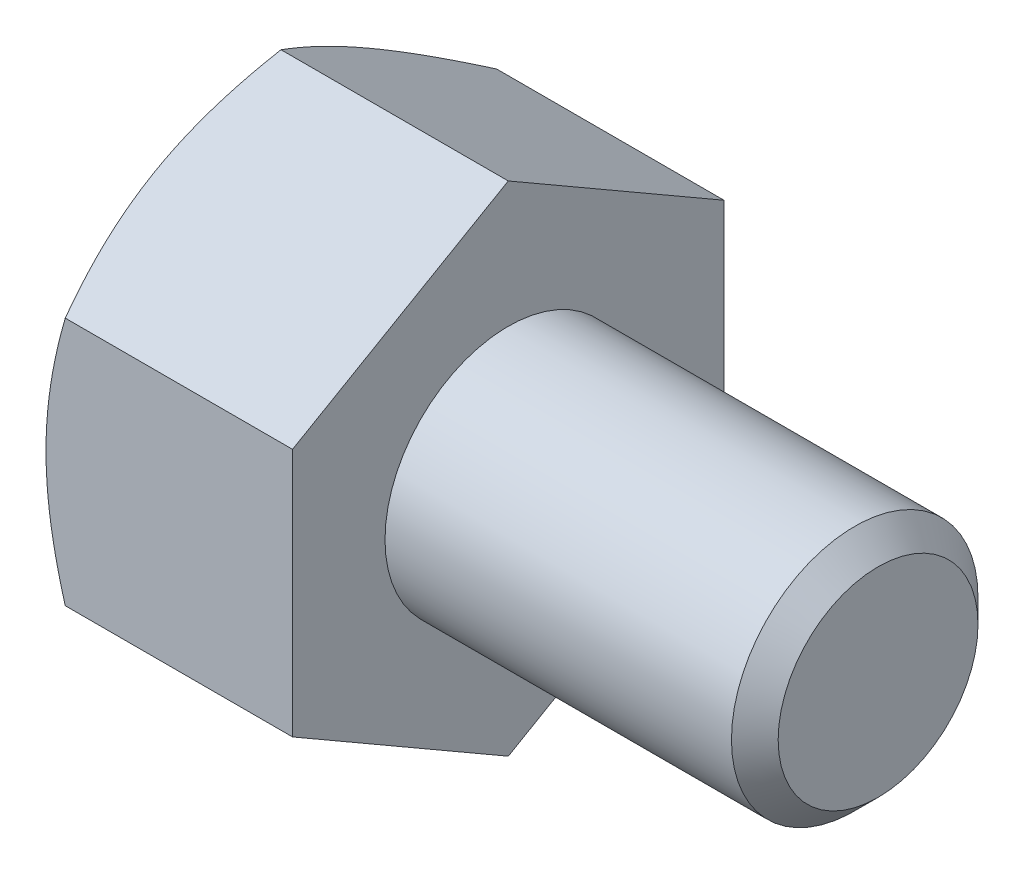
ISO-10303-21;
HEADER;
FILE_DESCRIPTION(('STEP AP214'),'2;1');
FILE_NAME('part.step','',(''),(''),'','','');
FILE_SCHEMA(('AUTOMOTIVE_DESIGN { 1 0 10303 214 1 1 1 1 }'));
ENDSEC;
DATA;
#1=APPLICATION_CONTEXT('core data for automotive mechanical design processes');
#2=APPLICATION_PROTOCOL_DEFINITION('international standard','automotive_design',2000,#1);
#3=PRODUCT_CONTEXT('',#1,'mechanical');
#4=PRODUCT('Part','Part','',(#3));
#5=PRODUCT_RELATED_PRODUCT_CATEGORY('part','',(#4));
#6=PRODUCT_DEFINITION_FORMATION('','',#4);
#7=PRODUCT_DEFINITION_CONTEXT('part definition',#1,'design');
#8=PRODUCT_DEFINITION('design','',#6,#7);
#9=PRODUCT_DEFINITION_SHAPE('','',#8);
#10=(LENGTH_UNIT() NAMED_UNIT(*) SI_UNIT(.MILLI.,.METRE.));
#11=(NAMED_UNIT(*) PLANE_ANGLE_UNIT() SI_UNIT($,.RADIAN.));
#12=(NAMED_UNIT(*) SI_UNIT($,.STERADIAN.) SOLID_ANGLE_UNIT());
#13=UNCERTAINTY_MEASURE_WITH_UNIT(LENGTH_MEASURE(1.E-05),#10,'distance_accuracy_value','');
#14=(GEOMETRIC_REPRESENTATION_CONTEXT(3) GLOBAL_UNCERTAINTY_ASSIGNED_CONTEXT((#13)) GLOBAL_UNIT_ASSIGNED_CONTEXT((#10,
#11,#12)) REPRESENTATION_CONTEXT('',''));
#15=CARTESIAN_POINT('',(0.,0.,0.));
#16=DIRECTION('',(0.,0.,1.));
#17=DIRECTION('',(1.,0.,0.));
#18=AXIS2_PLACEMENT_3D('',#15,#16,#17);
#19=CARTESIAN_POINT('',(-4.,0.,0.));
#20=DIRECTION('',(-1.,0.,0.));
#21=DIRECTION('',(0.,0.,1.));
#22=AXIS2_PLACEMENT_3D('',#19,#20,#21);
#23=PLANE('',#22);
#24=CARTESIAN_POINT('',(-4.,0.,0.));
#25=DIRECTION('',(1.,0.,0.));
#26=DIRECTION('',(0.,1.,0.));
#27=AXIS2_PLACEMENT_3D('',#24,#25,#26);
#28=CIRCLE('',#27,3.5);
#29=CARTESIAN_POINT('',(-4.,-3.03108891324554,-1.75));
#30=VERTEX_POINT('',#29);
#31=CARTESIAN_POINT('',(-4.,0.,-3.5));
#32=VERTEX_POINT('',#31);
#33=EDGE_CURVE('E199',#30,#32,#28,.T.);
#34=ORIENTED_EDGE('',*,*,#33,.F.);
#35=CARTESIAN_POINT('',(-4.,0.,0.));
#36=DIRECTION('',(1.,0.,0.));
#37=DIRECTION('',(0.,1.,0.));
#38=AXIS2_PLACEMENT_3D('',#35,#36,#37);
#39=CIRCLE('',#38,3.5);
#40=CARTESIAN_POINT('',(-4.,-3.03108891324554,1.75));
#41=VERTEX_POINT('',#40);
#42=EDGE_CURVE('E164',#41,#30,#39,.T.);
#43=ORIENTED_EDGE('',*,*,#42,.F.);
#44=CARTESIAN_POINT('',(-4.,0.,0.));
#45=DIRECTION('',(1.,0.,0.));
#46=DIRECTION('',(0.,1.,0.));
#47=AXIS2_PLACEMENT_3D('',#44,#45,#46);
#48=CIRCLE('',#47,3.5);
#49=CARTESIAN_POINT('',(-4.,0.,3.5));
#50=VERTEX_POINT('',#49);
#51=EDGE_CURVE('E188',#50,#41,#48,.T.);
#52=ORIENTED_EDGE('',*,*,#51,.F.);
#53=CARTESIAN_POINT('',(-4.,0.,0.));
#54=DIRECTION('',(1.,0.,0.));
#55=DIRECTION('',(0.,1.,0.));
#56=AXIS2_PLACEMENT_3D('',#53,#54,#55);
#57=CIRCLE('',#56,3.5);
#58=CARTESIAN_POINT('',(-4.,3.03108891324554,1.75));
#59=VERTEX_POINT('',#58);
#60=EDGE_CURVE('E166',#59,#50,#57,.T.);
#61=ORIENTED_EDGE('',*,*,#60,.F.);
#62=CARTESIAN_POINT('',(-4.,0.,0.));
#63=DIRECTION('',(1.,0.,0.));
#64=DIRECTION('',(0.,1.,0.));
#65=AXIS2_PLACEMENT_3D('',#62,#63,#64);
#66=CIRCLE('',#65,3.5);
#67=CARTESIAN_POINT('',(-4.,3.03108891324554,-1.75));
#68=VERTEX_POINT('',#67);
#69=EDGE_CURVE('E210',#68,#59,#66,.T.);
#70=ORIENTED_EDGE('',*,*,#69,.F.);
#71=CARTESIAN_POINT('',(-4.,0.,0.));
#72=DIRECTION('',(1.,0.,0.));
#73=DIRECTION('',(0.,1.,0.));
#74=AXIS2_PLACEMENT_3D('',#71,#72,#73);
#75=CIRCLE('',#74,3.5);
#76=EDGE_CURVE('E56',#32,#68,#75,.T.);
#77=ORIENTED_EDGE('',*,*,#76,.F.);
#78=EDGE_LOOP('',(#34,#43,#52,#61,#70,#77));
#79=FACE_BOUND('',#78,.T.);
#80=ADVANCED_FACE('F39',(#79),#23,.T.);
#81=CARTESIAN_POINT('',(0.,3.03108891324554,-1.75));
#82=DIRECTION('',(0.,0.866025403784439,-0.5));
#83=DIRECTION('',(0.,-0.5,-0.866025403784439));
#84=AXIS2_PLACEMENT_3D('',#81,#82,#83);
#85=PLANE('',#84);
#86=CARTESIAN_POINT('',(-3.68678747896463,4.04249959269281,0.00181468412044147));
#87=CARTESIAN_POINT('',(-4.,3.50042101507722,-0.937092954004437));
#88=CARTESIAN_POINT('',(-4.,3.03108891324554,-1.75));
#89=CARTESIAN_POINT('',(-4.00000000000001,2.56175681141386,-2.56290704599557));
#90=CARTESIAN_POINT('',(-3.68678747896463,2.01967823379826,-3.50181468412044));
#91=(BOUNDED_CURVE() B_SPLINE_CURVE(2,(#86,#87,#88,#89,#90),.UNSPECIFIED.,.F.,
.F.) B_SPLINE_CURVE_WITH_KNOTS((3,2,3),(0.,2.05216073912997,4.10432147825994),
.UNSPECIFIED.) CURVE() GEOMETRIC_REPRESENTATION_ITEM() RATIONAL_B_SPLINE_CURVE((1.,
1.03802697460136,1.,1.03802697460135,1.)) REPRESENTATION_ITEM(''));
#92=CARTESIAN_POINT('',(-3.68739260883024,4.04145188432738,0.));
#93=VERTEX_POINT('',#92);
#94=EDGE_CURVE('E242',#93,#68,#91,.T.);
#95=ORIENTED_EDGE('',*,*,#94,.F.);
#96=DIRECTION('',(-1.,0.,0.));
#97=VECTOR('',#96,1.);
#98=CARTESIAN_POINT('',(0.,4.04145188432738,0.));
#99=LINE('',#98,#97);
#100=CARTESIAN_POINT('',(0.,4.04145188432738,0.));
#101=VERTEX_POINT('',#100);
#102=EDGE_CURVE('E112',#101,#93,#99,.T.);
#103=ORIENTED_EDGE('',*,*,#102,.F.);
#104=DIRECTION('',(0.,0.5,0.866025403784439));
#105=VECTOR('',#104,1.);
#106=CARTESIAN_POINT('',(0.,4.04145188432738,0.));
#107=LINE('',#106,#105);
#108=CARTESIAN_POINT('',(0.,2.02072594216369,-3.5));
#109=VERTEX_POINT('',#108);
#110=EDGE_CURVE('E90',#109,#101,#107,.T.);
#111=ORIENTED_EDGE('',*,*,#110,.F.);
#112=DIRECTION('',(-1.,0.,0.));
#113=VECTOR('',#112,1.);
#114=CARTESIAN_POINT('',(0.,2.02072594216369,-3.5));
#115=LINE('',#114,#113);
#116=CARTESIAN_POINT('',(-3.68739260883024,2.02072594216369,-3.5));
#117=VERTEX_POINT('',#116);
#118=EDGE_CURVE('E82',#109,#117,#115,.T.);
#119=ORIENTED_EDGE('',*,*,#118,.T.);
#120=CARTESIAN_POINT('',(-3.68678747896463,4.04249959269281,0.00181468412044147));
#121=CARTESIAN_POINT('',(-4.,3.50042101507722,-0.937092954004437));
#122=CARTESIAN_POINT('',(-4.,3.03108891324554,-1.75));
#123=CARTESIAN_POINT('',(-4.00000000000001,2.56175681141386,-2.56290704599557));
#124=CARTESIAN_POINT('',(-3.68678747896463,2.01967823379826,-3.50181468412044));
#125=(BOUNDED_CURVE() B_SPLINE_CURVE(2,(#120,#121,#122,#123,#124),.UNSPECIFIED.,.F.,
.F.) B_SPLINE_CURVE_WITH_KNOTS((3,2,3),(0.,2.05216073912997,4.10432147825994),
.UNSPECIFIED.) CURVE() GEOMETRIC_REPRESENTATION_ITEM() RATIONAL_B_SPLINE_CURVE((1.,
1.03802697460136,1.,1.03802697460135,1.)) REPRESENTATION_ITEM(''));
#126=EDGE_CURVE('E200',#68,#117,#125,.T.);
#127=ORIENTED_EDGE('',*,*,#126,.F.);
#128=EDGE_LOOP('',(#95,#103,#111,#119,#127));
#129=FACE_BOUND('',#128,.T.);
#130=ADVANCED_FACE('F320',(#129),#85,.T.);
#131=CARTESIAN_POINT('',(0.,0.,3.5));
#132=DIRECTION('',(0.,0.,1.));
#133=DIRECTION('',(0.,1.,0.));
#134=AXIS2_PLACEMENT_3D('',#131,#132,#133);
#135=PLANE('',#134);
#136=CARTESIAN_POINT('',(-3.68678747896463,-2.02282135889455,3.5));
#137=CARTESIAN_POINT('',(-4.,-0.938664203663368,3.5));
#138=CARTESIAN_POINT('',(-4.,0.,3.5));
#139=CARTESIAN_POINT('',(-4.,0.938664203663368,3.5));
#140=CARTESIAN_POINT('',(-3.68678747896463,2.02282135889455,3.5));
#141=(BOUNDED_CURVE() B_SPLINE_CURVE(2,(#136,#137,#138,#139,#140),.UNSPECIFIED.,.F.,
.F.) B_SPLINE_CURVE_WITH_KNOTS((3,2,3),(0.,2.05216073912997,4.10432147825995),
.UNSPECIFIED.) CURVE() GEOMETRIC_REPRESENTATION_ITEM() RATIONAL_B_SPLINE_CURVE((1.,
1.03802697460136,1.,1.03802697460134,1.)) REPRESENTATION_ITEM(''));
#142=CARTESIAN_POINT('',(-3.68739260883024,-2.02072594216369,3.5));
#143=VERTEX_POINT('',#142);
#144=EDGE_CURVE('E181',#143,#50,#141,.T.);
#145=ORIENTED_EDGE('',*,*,#144,.F.);
#146=DIRECTION('',(-1.,0.,0.));
#147=VECTOR('',#146,1.);
#148=CARTESIAN_POINT('',(0.,-2.02072594216369,3.5));
#149=LINE('',#148,#147);
#150=CARTESIAN_POINT('',(0.,-2.02072594216369,3.5));
#151=VERTEX_POINT('',#150);
#152=EDGE_CURVE('E153',#151,#143,#149,.T.);
#153=ORIENTED_EDGE('',*,*,#152,.F.);
#154=DIRECTION('',(0.,-1.,0.));
#155=VECTOR('',#154,1.);
#156=CARTESIAN_POINT('',(0.,-2.02072594216369,3.5));
#157=LINE('',#156,#155);
#158=CARTESIAN_POINT('',(0.,2.02072594216369,3.5));
#159=VERTEX_POINT('',#158);
#160=EDGE_CURVE('E120',#159,#151,#157,.T.);
#161=ORIENTED_EDGE('',*,*,#160,.F.);
#162=DIRECTION('',(-1.,0.,0.));
#163=VECTOR('',#162,1.);
#164=CARTESIAN_POINT('',(0.,2.02072594216369,3.5));
#165=LINE('',#164,#163);
#166=CARTESIAN_POINT('',(-3.68739260883024,2.02072594216369,3.5));
#167=VERTEX_POINT('',#166);
#168=EDGE_CURVE('E155',#159,#167,#165,.T.);
#169=ORIENTED_EDGE('',*,*,#168,.T.);
#170=CARTESIAN_POINT('',(-3.68678747896463,-2.02282135889455,3.5));
#171=CARTESIAN_POINT('',(-4.,-0.938664203663368,3.5));
#172=CARTESIAN_POINT('',(-4.,0.,3.5));
#173=CARTESIAN_POINT('',(-4.,0.938664203663368,3.5));
#174=CARTESIAN_POINT('',(-3.68678747896463,2.02282135889455,3.5));
#175=(BOUNDED_CURVE() B_SPLINE_CURVE(2,(#170,#171,#172,#173,#174),.UNSPECIFIED.,.F.,
.F.) B_SPLINE_CURVE_WITH_KNOTS((3,2,3),(0.,2.05216073912997,4.10432147825995),
.UNSPECIFIED.) CURVE() GEOMETRIC_REPRESENTATION_ITEM() RATIONAL_B_SPLINE_CURVE((1.,
1.03802697460136,1.,1.03802697460134,1.)) REPRESENTATION_ITEM(''));
#176=EDGE_CURVE('E279',#50,#167,#175,.T.);
#177=ORIENTED_EDGE('',*,*,#176,.F.);
#178=EDGE_LOOP('',(#145,#153,#161,#169,#177));
#179=FACE_BOUND('',#178,.T.);
#180=ADVANCED_FACE('F326',(#179),#135,.T.);
#181=CARTESIAN_POINT('',(0.,3.03108891324554,1.75));
#182=DIRECTION('',(0.,0.866025403784439,0.5));
#183=DIRECTION('',(0.,0.5,-0.866025403784439));
#184=AXIS2_PLACEMENT_3D('',#181,#182,#183);
#185=PLANE('',#184);
#186=CARTESIAN_POINT('',(-3.68678747896463,2.01967823379826,3.50181468412044));
#187=CARTESIAN_POINT('',(-4.,2.56175681141385,2.56290704599557));
#188=CARTESIAN_POINT('',(-4.,3.03108891324554,1.75));
#189=CARTESIAN_POINT('',(-4.,3.50042101507723,0.937092954004432));
#190=CARTESIAN_POINT('',(-3.68678747896463,4.04249959269281,-0.00181468412044195));
#191=(BOUNDED_CURVE() B_SPLINE_CURVE(2,(#186,#187,#188,#189,#190),.UNSPECIFIED.,.F.,
.F.) B_SPLINE_CURVE_WITH_KNOTS((3,2,3),(0.,2.05216073912997,4.10432147825994),
.UNSPECIFIED.) CURVE() GEOMETRIC_REPRESENTATION_ITEM() RATIONAL_B_SPLINE_CURVE((1.,
1.03802697460135,1.,1.03802697460133,1.)) REPRESENTATION_ITEM(''));
#192=EDGE_CURVE('E211',#167,#59,#191,.T.);
#193=ORIENTED_EDGE('',*,*,#192,.F.);
#194=ORIENTED_EDGE('',*,*,#168,.F.);
#195=DIRECTION('',(0.,-0.5,0.866025403784439));
#196=VECTOR('',#195,1.);
#197=CARTESIAN_POINT('',(0.,2.02072594216369,3.5));
#198=LINE('',#197,#196);
#199=EDGE_CURVE('E548',#101,#159,#198,.T.);
#200=ORIENTED_EDGE('',*,*,#199,.F.);
#201=ORIENTED_EDGE('',*,*,#102,.T.);
#202=CARTESIAN_POINT('',(-3.68678747896463,2.01967823379826,3.50181468412044));
#203=CARTESIAN_POINT('',(-4.,2.56175681141385,2.56290704599557));
#204=CARTESIAN_POINT('',(-4.,3.03108891324554,1.75));
#205=CARTESIAN_POINT('',(-4.,3.50042101507723,0.937092954004432));
#206=CARTESIAN_POINT('',(-3.68678747896463,4.04249959269281,-0.00181468412044195));
#207=(BOUNDED_CURVE() B_SPLINE_CURVE(2,(#202,#203,#204,#205,#206),.UNSPECIFIED.,.F.,
.F.) B_SPLINE_CURVE_WITH_KNOTS((3,2,3),(0.,2.05216073912997,4.10432147825994),
.UNSPECIFIED.) CURVE() GEOMETRIC_REPRESENTATION_ITEM() RATIONAL_B_SPLINE_CURVE((1.,
1.03802697460135,1.,1.03802697460133,1.)) REPRESENTATION_ITEM(''));
#208=EDGE_CURVE('E292',#59,#93,#207,.T.);
#209=ORIENTED_EDGE('',*,*,#208,.F.);
#210=EDGE_LOOP('',(#193,#194,#200,#201,#209));
#211=FACE_BOUND('',#210,.T.);
#212=ADVANCED_FACE('F343',(#211),#185,.T.);
#213=CARTESIAN_POINT('',(0.,0.,-3.5));
#214=DIRECTION('',(0.,0.,-1.));
#215=DIRECTION('',(0.,-1.,0.));
#216=AXIS2_PLACEMENT_3D('',#213,#214,#215);
#217=PLANE('',#216);
#218=CARTESIAN_POINT('',(-3.68678747896463,2.02282135889455,-3.5));
#219=CARTESIAN_POINT('',(-4.,0.938664203663368,-3.5));
#220=CARTESIAN_POINT('',(-4.,0.,-3.5));
#221=CARTESIAN_POINT('',(-4.,-0.938664203663368,-3.5));
#222=CARTESIAN_POINT('',(-3.68678747896463,-2.02282135889455,-3.5));
#223=(BOUNDED_CURVE() B_SPLINE_CURVE(2,(#218,#219,#220,#221,#222),.UNSPECIFIED.,.F.,
.F.) B_SPLINE_CURVE_WITH_KNOTS((3,2,3),(0.,2.05216073912997,4.10432147825995),
.UNSPECIFIED.) CURVE() GEOMETRIC_REPRESENTATION_ITEM() RATIONAL_B_SPLINE_CURVE((1.,
1.03802697460134,1.,1.03802697460134,1.)) REPRESENTATION_ITEM(''));
#224=EDGE_CURVE('E209',#117,#32,#223,.T.);
#225=ORIENTED_EDGE('',*,*,#224,.F.);
#226=ORIENTED_EDGE('',*,*,#118,.F.);
#227=DIRECTION('',(0.,1.,0.));
#228=VECTOR('',#227,1.);
#229=CARTESIAN_POINT('',(0.,2.02072594216369,-3.5));
#230=LINE('',#229,#228);
#231=CARTESIAN_POINT('',(0.,-2.02072594216369,-3.5));
#232=VERTEX_POINT('',#231);
#233=EDGE_CURVE('E131',#232,#109,#230,.T.);
#234=ORIENTED_EDGE('',*,*,#233,.F.);
#235=DIRECTION('',(-1.,0.,0.));
#236=VECTOR('',#235,1.);
#237=CARTESIAN_POINT('',(0.,-2.02072594216369,-3.5));
#238=LINE('',#237,#236);
#239=CARTESIAN_POINT('',(-3.68739260883024,-2.02072594216369,-3.5));
#240=VERTEX_POINT('',#239);
#241=EDGE_CURVE('E136',#232,#240,#238,.T.);
#242=ORIENTED_EDGE('',*,*,#241,.T.);
#243=CARTESIAN_POINT('',(-3.68678747896463,2.02282135889455,-3.5));
#244=CARTESIAN_POINT('',(-4.,0.938664203663368,-3.5));
#245=CARTESIAN_POINT('',(-4.,0.,-3.5));
#246=CARTESIAN_POINT('',(-4.,-0.938664203663368,-3.5));
#247=CARTESIAN_POINT('',(-3.68678747896463,-2.02282135889455,-3.5));
#248=(BOUNDED_CURVE() B_SPLINE_CURVE(2,(#243,#244,#245,#246,#247),.UNSPECIFIED.,.F.,
.F.) B_SPLINE_CURVE_WITH_KNOTS((3,2,3),(0.,2.05216073912997,4.10432147825995),
.UNSPECIFIED.) CURVE() GEOMETRIC_REPRESENTATION_ITEM() RATIONAL_B_SPLINE_CURVE((1.,
1.03802697460134,1.,1.03802697460134,1.)) REPRESENTATION_ITEM(''));
#249=EDGE_CURVE('E165',#32,#240,#248,.T.);
#250=ORIENTED_EDGE('',*,*,#249,.F.);
#251=EDGE_LOOP('',(#225,#226,#234,#242,#250));
#252=FACE_BOUND('',#251,.T.);
#253=ADVANCED_FACE('F145',(#252),#217,.T.);
#254=CARTESIAN_POINT('',(0.,-3.03108891324554,-1.75));
#255=DIRECTION('',(0.,-0.866025403784439,-0.5));
#256=DIRECTION('',(0.,-0.5,0.866025403784439));
#257=AXIS2_PLACEMENT_3D('',#254,#255,#256);
#258=PLANE('',#257);
#259=CARTESIAN_POINT('',(-3.68678747896463,-2.01967823379826,-3.50181468412044));
#260=CARTESIAN_POINT('',(-4.,-2.56175681141386,-2.56290704599556));
#261=CARTESIAN_POINT('',(-4.,-3.03108891324554,-1.75));
#262=CARTESIAN_POINT('',(-4.,-3.50042101507721,-0.937092954004439));
#263=CARTESIAN_POINT('',(-3.68678747896463,-4.04249959269281,0.00181468412044005));
#264=(BOUNDED_CURVE() B_SPLINE_CURVE(2,(#259,#260,#261,#262,#263),.UNSPECIFIED.,.F.,
.F.) B_SPLINE_CURVE_WITH_KNOTS((3,2,3),(0.,2.05216073912997,4.10432147825994),
.UNSPECIFIED.) CURVE() GEOMETRIC_REPRESENTATION_ITEM() RATIONAL_B_SPLINE_CURVE((1.,
1.03802697460134,1.,1.03802697460133,1.)) REPRESENTATION_ITEM(''));
#265=EDGE_CURVE('E139',#240,#30,#264,.T.);
#266=ORIENTED_EDGE('',*,*,#265,.F.);
#267=ORIENTED_EDGE('',*,*,#241,.F.);
#268=DIRECTION('',(0.,0.5,-0.866025403784438));
#269=VECTOR('',#268,1.);
#270=CARTESIAN_POINT('',(0.,-2.02072594216369,-3.5));
#271=LINE('',#270,#269);
#272=CARTESIAN_POINT('',(0.,-4.04145188432738,0.));
#273=VERTEX_POINT('',#272);
#274=EDGE_CURVE('E127',#273,#232,#271,.T.);
#275=ORIENTED_EDGE('',*,*,#274,.F.);
#276=DIRECTION('',(-1.,0.,0.));
#277=VECTOR('',#276,1.);
#278=CARTESIAN_POINT('',(0.,-4.04145188432738,0.));
#279=LINE('',#278,#277);
#280=CARTESIAN_POINT('',(-3.68739260883024,-4.04145188432738,0.));
#281=VERTEX_POINT('',#280);
#282=EDGE_CURVE('E143',#273,#281,#279,.T.);
#283=ORIENTED_EDGE('',*,*,#282,.T.);
#284=CARTESIAN_POINT('',(-3.68678747896463,-2.01967823379826,-3.50181468412044));
#285=CARTESIAN_POINT('',(-4.,-2.56175681141386,-2.56290704599556));
#286=CARTESIAN_POINT('',(-4.,-3.03108891324554,-1.75));
#287=CARTESIAN_POINT('',(-4.,-3.50042101507721,-0.937092954004439));
#288=CARTESIAN_POINT('',(-3.68678747896463,-4.04249959269281,0.00181468412044005));
#289=(BOUNDED_CURVE() B_SPLINE_CURVE(2,(#284,#285,#286,#287,#288),.UNSPECIFIED.,.F.,
.F.) B_SPLINE_CURVE_WITH_KNOTS((3,2,3),(0.,2.05216073912997,4.10432147825994),
.UNSPECIFIED.) CURVE() GEOMETRIC_REPRESENTATION_ITEM() RATIONAL_B_SPLINE_CURVE((1.,
1.03802697460134,1.,1.03802697460133,1.)) REPRESENTATION_ITEM(''));
#290=EDGE_CURVE('E75',#30,#281,#289,.T.);
#291=ORIENTED_EDGE('',*,*,#290,.F.);
#292=EDGE_LOOP('',(#266,#267,#275,#283,#291));
#293=FACE_BOUND('',#292,.T.);
#294=ADVANCED_FACE('F137',(#293),#258,.T.);
#295=CARTESIAN_POINT('',(0.,-3.03108891324554,1.75));
#296=DIRECTION('',(0.,-0.866025403784439,0.5));
#297=DIRECTION('',(0.,0.5,0.866025403784439));
#298=AXIS2_PLACEMENT_3D('',#295,#296,#297);
#299=PLANE('',#298);
#300=CARTESIAN_POINT('',(-3.68678747896463,-4.04249959269281,-0.00181468412044504));
#301=CARTESIAN_POINT('',(-4.00000000000001,-3.50042101507722,0.937092954004434));
#302=CARTESIAN_POINT('',(-4.,-3.03108891324554,1.75));
#303=CARTESIAN_POINT('',(-4.,-2.56175681141385,2.56290704599557));
#304=CARTESIAN_POINT('',(-3.68678747896463,-2.01967823379826,3.50181468412045));
#305=(BOUNDED_CURVE() B_SPLINE_CURVE(2,(#300,#301,#302,#303,#304),.UNSPECIFIED.,.F.,
.F.) B_SPLINE_CURVE_WITH_KNOTS((3,2,3),(0.,2.05216073912997,4.10432147825995),
.UNSPECIFIED.) CURVE() GEOMETRIC_REPRESENTATION_ITEM() RATIONAL_B_SPLINE_CURVE((1.,
1.03802697460133,1.,1.03802697460133,1.)) REPRESENTATION_ITEM(''));
#306=EDGE_CURVE('E157',#281,#41,#305,.T.);
#307=ORIENTED_EDGE('',*,*,#306,.F.);
#308=ORIENTED_EDGE('',*,*,#282,.F.);
#309=DIRECTION('',(0.,-0.5,-0.866025403784439));
#310=VECTOR('',#309,1.);
#311=CARTESIAN_POINT('',(0.,-4.04145188432738,0.));
#312=LINE('',#311,#310);
#313=EDGE_CURVE('E133',#151,#273,#312,.T.);
#314=ORIENTED_EDGE('',*,*,#313,.F.);
#315=ORIENTED_EDGE('',*,*,#152,.T.);
#316=CARTESIAN_POINT('',(-3.68678747896463,-4.04249959269281,-0.00181468412044504));
#317=CARTESIAN_POINT('',(-4.00000000000001,-3.50042101507722,0.937092954004434));
#318=CARTESIAN_POINT('',(-4.,-3.03108891324554,1.75));
#319=CARTESIAN_POINT('',(-4.,-2.56175681141385,2.56290704599557));
#320=CARTESIAN_POINT('',(-3.68678747896463,-2.01967823379826,3.50181468412045));
#321=(BOUNDED_CURVE() B_SPLINE_CURVE(2,(#316,#317,#318,#319,#320),.UNSPECIFIED.,.F.,
.F.) B_SPLINE_CURVE_WITH_KNOTS((3,2,3),(0.,2.05216073912997,4.10432147825995),
.UNSPECIFIED.) CURVE() GEOMETRIC_REPRESENTATION_ITEM() RATIONAL_B_SPLINE_CURVE((1.,
1.03802697460133,1.,1.03802697460133,1.)) REPRESENTATION_ITEM(''));
#322=EDGE_CURVE('E241',#41,#143,#321,.T.);
#323=ORIENTED_EDGE('',*,*,#322,.F.);
#324=EDGE_LOOP('',(#307,#308,#314,#315,#323));
#325=FACE_BOUND('',#324,.T.);
#326=ADVANCED_FACE('F340',(#325),#299,.T.);
#327=CARTESIAN_POINT('',(-3.84339373948232,0.,0.));
#328=DIRECTION('',(1.,0.,0.));
#329=DIRECTION('',(0.,1.,0.));
#330=AXIS2_PLACEMENT_3D('',#327,#328,#329);
#331=CONICAL_SURFACE('',#330,3.77125,1.0471975511966);
#332=ORIENTED_EDGE('',*,*,#126,.T.);
#333=ORIENTED_EDGE('',*,*,#224,.T.);
#334=ORIENTED_EDGE('',*,*,#76,.T.);
#335=EDGE_LOOP('',(#332,#333,#334));
#336=FACE_BOUND('',#335,.T.);
#337=ADVANCED_FACE('F346',(#336),#331,.T.);
#338=CARTESIAN_POINT('',(-3.84339373948232,0.,0.));
#339=DIRECTION('',(1.,0.,0.));
#340=DIRECTION('',(0.,1.,0.));
#341=AXIS2_PLACEMENT_3D('',#338,#339,#340);
#342=CONICAL_SURFACE('',#341,3.77125,1.0471975511966);
#343=ORIENTED_EDGE('',*,*,#208,.T.);
#344=ORIENTED_EDGE('',*,*,#94,.T.);
#345=ORIENTED_EDGE('',*,*,#69,.T.);
#346=EDGE_LOOP('',(#343,#344,#345));
#347=FACE_BOUND('',#346,.T.);
#348=ADVANCED_FACE('F348',(#347),#342,.T.);
#349=CARTESIAN_POINT('',(-3.84339373948232,0.,0.));
#350=DIRECTION('',(1.,0.,0.));
#351=DIRECTION('',(0.,1.,0.));
#352=AXIS2_PLACEMENT_3D('',#349,#350,#351);
#353=CONICAL_SURFACE('',#352,3.77125,1.0471975511966);
#354=ORIENTED_EDGE('',*,*,#176,.T.);
#355=ORIENTED_EDGE('',*,*,#192,.T.);
#356=ORIENTED_EDGE('',*,*,#60,.T.);
#357=EDGE_LOOP('',(#354,#355,#356));
#358=FACE_BOUND('',#357,.T.);
#359=ADVANCED_FACE('F336',(#358),#353,.T.);
#360=CARTESIAN_POINT('',(-3.84339373948232,0.,0.));
#361=DIRECTION('',(1.,0.,0.));
#362=DIRECTION('',(0.,1.,0.));
#363=AXIS2_PLACEMENT_3D('',#360,#361,#362);
#364=CONICAL_SURFACE('',#363,3.77125,1.0471975511966);
#365=ORIENTED_EDGE('',*,*,#144,.T.);
#366=ORIENTED_EDGE('',*,*,#51,.T.);
#367=ORIENTED_EDGE('',*,*,#322,.T.);
#368=EDGE_LOOP('',(#365,#366,#367));
#369=FACE_BOUND('',#368,.T.);
#370=ADVANCED_FACE('F332',(#369),#364,.T.);
#371=CARTESIAN_POINT('',(-3.84339373948232,0.,0.));
#372=DIRECTION('',(1.,0.,0.));
#373=DIRECTION('',(0.,1.,0.));
#374=AXIS2_PLACEMENT_3D('',#371,#372,#373);
#375=CONICAL_SURFACE('',#374,3.77125,1.0471975511966);
#376=ORIENTED_EDGE('',*,*,#306,.T.);
#377=ORIENTED_EDGE('',*,*,#42,.T.);
#378=ORIENTED_EDGE('',*,*,#290,.T.);
#379=EDGE_LOOP('',(#376,#377,#378));
#380=FACE_BOUND('',#379,.T.);
#381=ADVANCED_FACE('F335',(#380),#375,.T.);
#382=CARTESIAN_POINT('',(-3.84339373948232,0.,0.));
#383=DIRECTION('',(1.,0.,0.));
#384=DIRECTION('',(0.,1.,0.));
#385=AXIS2_PLACEMENT_3D('',#382,#383,#384);
#386=CONICAL_SURFACE('',#385,3.77125,1.0471975511966);
#387=ORIENTED_EDGE('',*,*,#265,.T.);
#388=ORIENTED_EDGE('',*,*,#33,.T.);
#389=ORIENTED_EDGE('',*,*,#249,.T.);
#390=EDGE_LOOP('',(#387,#388,#389));
#391=FACE_BOUND('',#390,.T.);
#392=ADVANCED_FACE('F357',(#391),#386,.T.);
#393=CARTESIAN_POINT('',(0.,0.,0.));
#394=DIRECTION('',(-1.,0.,0.));
#395=DIRECTION('',(0.,-1.,0.));
#396=AXIS2_PLACEMENT_3D('',#393,#394,#395);
#397=PLANE('',#396);
#398=CARTESIAN_POINT('',(0.,0.,0.));
#399=DIRECTION('',(-1.,0.,0.));
#400=DIRECTION('',(0.,0.,1.));
#401=AXIS2_PLACEMENT_3D('',#398,#399,#400);
#402=CIRCLE('',#401,2.);
#403=CARTESIAN_POINT('',(0.,0.,2.));
#404=VERTEX_POINT('',#403);
#405=EDGE_CURVE('E547',#404,#404,#402,.T.);
#406=ORIENTED_EDGE('',*,*,#405,.T.);
#407=EDGE_LOOP('',(#406));
#408=FACE_BOUND('',#407,.T.);
#409=ORIENTED_EDGE('',*,*,#199,.T.);
#410=ORIENTED_EDGE('',*,*,#160,.T.);
#411=ORIENTED_EDGE('',*,*,#313,.T.);
#412=ORIENTED_EDGE('',*,*,#274,.T.);
#413=ORIENTED_EDGE('',*,*,#233,.T.);
#414=ORIENTED_EDGE('',*,*,#110,.T.);
#415=EDGE_LOOP('',(#409,#410,#411,#412,#413,#414));
#416=FACE_BOUND('',#415,.T.);
#417=ADVANCED_FACE('F129',(#408,#416),#397,.F.);
#418=CARTESIAN_POINT('',(6.,0.,0.));
#419=DIRECTION('',(-1.,0.,0.));
#420=DIRECTION('',(0.,0.,1.));
#421=AXIS2_PLACEMENT_3D('',#418,#419,#420);
#422=CYLINDRICAL_SURFACE('',#421,2.);
#423=CARTESIAN_POINT('',(5.62112500000001,0.,0.));
#424=DIRECTION('',(1.,0.,0.));
#425=DIRECTION('',(0.,0.,-1.));
#426=AXIS2_PLACEMENT_3D('',#423,#424,#425);
#427=CIRCLE('',#426,2.);
#428=CARTESIAN_POINT('',(5.62112500000001,0.,-2.));
#429=VERTEX_POINT('',#428);
#430=EDGE_CURVE('E48',#429,#429,#427,.F.);
#431=ORIENTED_EDGE('',*,*,#430,.T.);
#432=EDGE_LOOP('',(#431));
#433=FACE_BOUND('',#432,.T.);
#434=ORIENTED_EDGE('',*,*,#405,.F.);
#435=EDGE_LOOP('',(#434));
#436=FACE_BOUND('',#435,.T.);
#437=ADVANCED_FACE('F307',(#433,#436),#422,.T.);
#438=CARTESIAN_POINT('',(6.,2.,0.));
#439=DIRECTION('',(1.,0.,0.));
#440=DIRECTION('',(0.,0.,-1.));
#441=AXIS2_PLACEMENT_3D('',#438,#439,#440);
#442=PLANE('',#441);
#443=CARTESIAN_POINT('',(6.,0.,0.));
#444=DIRECTION('',(1.,0.,0.));
#445=DIRECTION('',(0.,0.,-1.));
#446=AXIS2_PLACEMENT_3D('',#443,#444,#445);
#447=CIRCLE('',#446,1.621125);
#448=CARTESIAN_POINT('',(6.,0.,-1.621125));
#449=VERTEX_POINT('',#448);
#450=EDGE_CURVE('E12',#449,#449,#447,.T.);
#451=ORIENTED_EDGE('',*,*,#450,.T.);
#452=EDGE_LOOP('',(#451));
#453=FACE_BOUND('',#452,.T.);
#454=ADVANCED_FACE('F311',(#453),#442,.T.);
#455=CARTESIAN_POINT('',(5.62112500000001,0.,0.));
#456=DIRECTION('',(-1.,0.,0.));
#457=DIRECTION('',(0.,0.,1.));
#458=AXIS2_PLACEMENT_3D('',#455,#456,#457);
#459=CONICAL_SURFACE('',#458,2.,0.785398163397455);
#460=ORIENTED_EDGE('',*,*,#450,.F.);
#461=EDGE_LOOP('',(#460));
#462=FACE_BOUND('',#461,.T.);
#463=ORIENTED_EDGE('',*,*,#430,.F.);
#464=EDGE_LOOP('',(#463));
#465=FACE_BOUND('',#464,.T.);
#466=ADVANCED_FACE('F41',(#462,#465),#459,.T.);
#467=CLOSED_SHELL('',(#80,#130,#180,#212,#253,#294,#326,#337,#348,#359,#370,#381,#392,#417,#437,
#454,#466));
#468=MANIFOLD_SOLID_BREP('B2',#467);
#469=ADVANCED_BREP_SHAPE_REPRESENTATION('',(#18,#468),#14);
#470=SHAPE_DEFINITION_REPRESENTATION(#9,#469);
ENDSEC;
END-ISO-10303-21;
